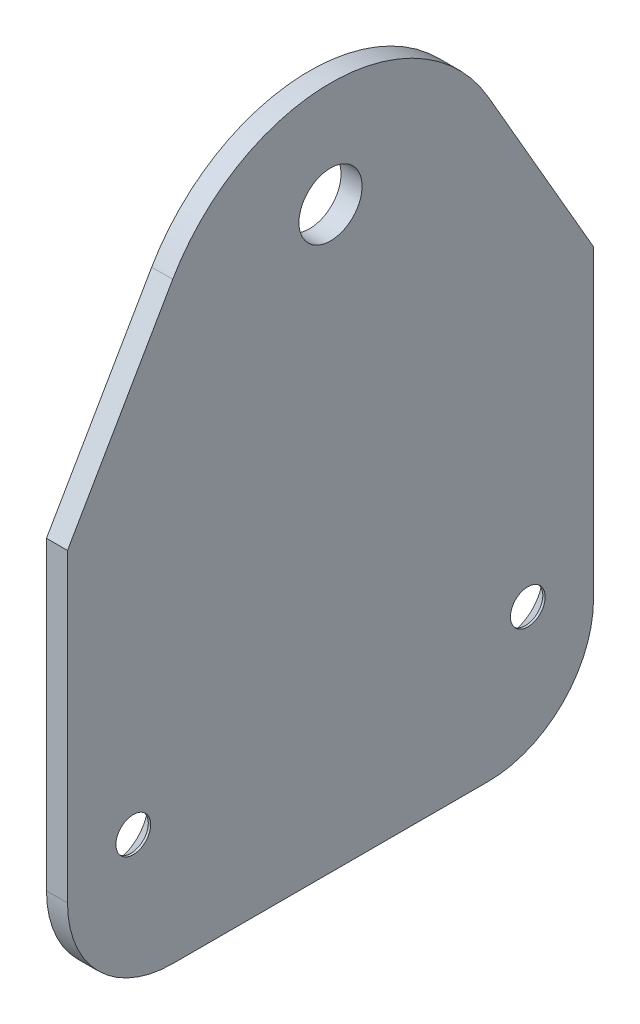
ISO-10303-21;
HEADER;
FILE_DESCRIPTION(('STEP AP214'),'2;1');
FILE_NAME('part.step','',(''),(''),'','','');
FILE_SCHEMA(('AUTOMOTIVE_DESIGN { 1 0 10303 214 1 1 1 1 }'));
ENDSEC;
DATA;
#1=APPLICATION_CONTEXT('core data for automotive mechanical design processes');
#2=APPLICATION_PROTOCOL_DEFINITION('international standard','automotive_design',2000,#1);
#3=PRODUCT_CONTEXT('',#1,'mechanical');
#4=PRODUCT('Part','Part','',(#3));
#5=PRODUCT_RELATED_PRODUCT_CATEGORY('part','',(#4));
#6=PRODUCT_DEFINITION_FORMATION('','',#4);
#7=PRODUCT_DEFINITION_CONTEXT('part definition',#1,'design');
#8=PRODUCT_DEFINITION('design','',#6,#7);
#9=PRODUCT_DEFINITION_SHAPE('','',#8);
#10=(LENGTH_UNIT() NAMED_UNIT(*) SI_UNIT(.MILLI.,.METRE.));
#11=(NAMED_UNIT(*) PLANE_ANGLE_UNIT() SI_UNIT($,.RADIAN.));
#12=(NAMED_UNIT(*) SI_UNIT($,.STERADIAN.) SOLID_ANGLE_UNIT());
#13=UNCERTAINTY_MEASURE_WITH_UNIT(LENGTH_MEASURE(1.E-05),#10,'distance_accuracy_value','');
#14=(GEOMETRIC_REPRESENTATION_CONTEXT(3) GLOBAL_UNCERTAINTY_ASSIGNED_CONTEXT((#13)) GLOBAL_UNIT_ASSIGNED_CONTEXT((#10,
#11,#12)) REPRESENTATION_CONTEXT('',''));
#15=CARTESIAN_POINT('',(0.,0.,0.));
#16=DIRECTION('',(0.,0.,1.));
#17=DIRECTION('',(1.,0.,0.));
#18=AXIS2_PLACEMENT_3D('',#15,#16,#17);
#19=CARTESIAN_POINT('',(-4.,95.3589838486225,0.));
#20=DIRECTION('',(-1.,0.,0.));
#21=DIRECTION('',(0.,0.,1.));
#22=AXIS2_PLACEMENT_3D('',#19,#20,#21);
#23=CYLINDRICAL_SURFACE('',#22,34.6410161513775);
#24=DIRECTION('',(1.,0.,0.));
#25=VECTOR('',#24,1.);
#26=CARTESIAN_POINT('',(-4.,112.679491924311,-29.9999999999999));
#27=LINE('',#26,#25);
#28=CARTESIAN_POINT('',(-4.,112.679491924311,-29.9999999999999));
#29=VERTEX_POINT('',#28);
#30=CARTESIAN_POINT('',(0.,112.679491924311,-29.9999999999999));
#31=VERTEX_POINT('',#30);
#32=EDGE_CURVE('E150',#29,#31,#27,.T.);
#33=ORIENTED_EDGE('',*,*,#32,.F.);
#34=CARTESIAN_POINT('',(-4.,95.3589838486225,0.));
#35=DIRECTION('',(-1.,0.,0.));
#36=DIRECTION('',(0.,0.,1.));
#37=AXIS2_PLACEMENT_3D('',#34,#35,#36);
#38=CIRCLE('',#37,34.6410161513775);
#39=CARTESIAN_POINT('',(-4.,112.679491924311,29.9999999999999));
#40=VERTEX_POINT('',#39);
#41=EDGE_CURVE('E155',#40,#29,#38,.T.);
#42=ORIENTED_EDGE('',*,*,#41,.F.);
#43=DIRECTION('',(1.,0.,0.));
#44=VECTOR('',#43,1.);
#45=CARTESIAN_POINT('',(-4.,112.679491924311,29.9999999999999));
#46=LINE('',#45,#44);
#47=CARTESIAN_POINT('',(0.,112.679491924311,29.9999999999999));
#48=VERTEX_POINT('',#47);
#49=EDGE_CURVE('E153',#48,#40,#46,.F.);
#50=ORIENTED_EDGE('',*,*,#49,.F.);
#51=CARTESIAN_POINT('',(0.,95.3589838486225,0.));
#52=DIRECTION('',(-1.,0.,0.));
#53=DIRECTION('',(0.,0.,1.));
#54=AXIS2_PLACEMENT_3D('',#51,#52,#53);
#55=CIRCLE('',#54,34.6410161513775);
#56=EDGE_CURVE('E118',#31,#48,#55,.F.);
#57=ORIENTED_EDGE('',*,*,#56,.F.);
#58=EDGE_LOOP('',(#33,#42,#50,#57));
#59=FACE_BOUND('',#58,.T.);
#60=ADVANCED_FACE('F48',(#59),#23,.T.);
#61=CARTESIAN_POINT('',(-4.,0.,50.));
#62=DIRECTION('',(0.,0.,1.));
#63=DIRECTION('',(1.,0.,0.));
#64=AXIS2_PLACEMENT_3D('',#61,#62,#63);
#65=PLANE('',#64);
#66=DIRECTION('',(0.,-1.,0.));
#67=VECTOR('',#66,1.);
#68=CARTESIAN_POINT('',(-4.,0.,50.));
#69=LINE('',#68,#67);
#70=CARTESIAN_POINT('',(-4.,78.0384757729337,50.));
#71=VERTEX_POINT('',#70);
#72=CARTESIAN_POINT('',(-4.,20.,50.));
#73=VERTEX_POINT('',#72);
#74=EDGE_CURVE('E170',#71,#73,#69,.T.);
#75=ORIENTED_EDGE('',*,*,#74,.T.);
#76=DIRECTION('',(1.,0.,0.));
#77=VECTOR('',#76,1.);
#78=CARTESIAN_POINT('',(-4.,20.,50.));
#79=LINE('',#78,#77);
#80=CARTESIAN_POINT('',(0.,20.,50.));
#81=VERTEX_POINT('',#80);
#82=EDGE_CURVE('E132',#73,#81,#79,.T.);
#83=ORIENTED_EDGE('',*,*,#82,.T.);
#84=DIRECTION('',(0.,-1.,0.));
#85=VECTOR('',#84,1.);
#86=CARTESIAN_POINT('',(0.,0.,50.));
#87=LINE('',#86,#85);
#88=CARTESIAN_POINT('',(0.,78.0384757729337,50.));
#89=VERTEX_POINT('',#88);
#90=EDGE_CURVE('E116',#89,#81,#87,.T.);
#91=ORIENTED_EDGE('',*,*,#90,.F.);
#92=DIRECTION('',(-1.,0.,0.));
#93=VECTOR('',#92,1.);
#94=CARTESIAN_POINT('',(-4.,78.0384757729337,50.));
#95=LINE('',#94,#93);
#96=EDGE_CURVE('E123',#89,#71,#95,.T.);
#97=ORIENTED_EDGE('',*,*,#96,.T.);
#98=EDGE_LOOP('',(#75,#83,#91,#97));
#99=FACE_BOUND('',#98,.T.);
#100=ADVANCED_FACE('F129',(#99),#65,.T.);
#101=CARTESIAN_POINT('',(-4.,0.,-50.));
#102=DIRECTION('',(0.,0.,-1.));
#103=DIRECTION('',(-1.,0.,0.));
#104=AXIS2_PLACEMENT_3D('',#101,#102,#103);
#105=PLANE('',#104);
#106=DIRECTION('',(0.,1.,0.));
#107=VECTOR('',#106,1.);
#108=CARTESIAN_POINT('',(0.,0.,-50.));
#109=LINE('',#108,#107);
#110=CARTESIAN_POINT('',(0.,20.,-50.));
#111=VERTEX_POINT('',#110);
#112=CARTESIAN_POINT('',(0.,78.0384757729337,-50.));
#113=VERTEX_POINT('',#112);
#114=EDGE_CURVE('E174',#111,#113,#109,.T.);
#115=ORIENTED_EDGE('',*,*,#114,.F.);
#116=DIRECTION('',(1.,0.,0.));
#117=VECTOR('',#116,1.);
#118=CARTESIAN_POINT('',(-4.,20.,-50.));
#119=LINE('',#118,#117);
#120=CARTESIAN_POINT('',(-4.,20.,-50.));
#121=VERTEX_POINT('',#120);
#122=EDGE_CURVE('E12',#111,#121,#119,.F.);
#123=ORIENTED_EDGE('',*,*,#122,.T.);
#124=DIRECTION('',(0.,1.,0.));
#125=VECTOR('',#124,1.);
#126=CARTESIAN_POINT('',(-4.,0.,-50.));
#127=LINE('',#126,#125);
#128=CARTESIAN_POINT('',(-4.,78.0384757729337,-50.));
#129=VERTEX_POINT('',#128);
#130=EDGE_CURVE('E188',#121,#129,#127,.T.);
#131=ORIENTED_EDGE('',*,*,#130,.T.);
#132=DIRECTION('',(1.,0.,0.));
#133=VECTOR('',#132,1.);
#134=CARTESIAN_POINT('',(-4.,78.0384757729337,-50.));
#135=LINE('',#134,#133);
#136=EDGE_CURVE('E147',#129,#113,#135,.T.);
#137=ORIENTED_EDGE('',*,*,#136,.T.);
#138=EDGE_LOOP('',(#115,#123,#131,#137));
#139=FACE_BOUND('',#138,.T.);
#140=ADVANCED_FACE('F245',(#139),#105,.T.);
#141=CARTESIAN_POINT('',(-4.,0.,50.));
#142=DIRECTION('',(0.,-1.,0.));
#143=DIRECTION('',(0.,0.,-1.));
#144=AXIS2_PLACEMENT_3D('',#141,#142,#143);
#145=PLANE('',#144);
#146=DIRECTION('',(0.,0.,-1.));
#147=VECTOR('',#146,1.);
#148=CARTESIAN_POINT('',(0.,0.,50.));
#149=LINE('',#148,#147);
#150=CARTESIAN_POINT('',(0.,0.,30.));
#151=VERTEX_POINT('',#150);
#152=CARTESIAN_POINT('',(0.,0.,-30.));
#153=VERTEX_POINT('',#152);
#154=EDGE_CURVE('E133',#151,#153,#149,.T.);
#155=ORIENTED_EDGE('',*,*,#154,.F.);
#156=DIRECTION('',(1.,0.,0.));
#157=VECTOR('',#156,1.);
#158=CARTESIAN_POINT('',(-4.,0.,30.));
#159=LINE('',#158,#157);
#160=CARTESIAN_POINT('',(-4.,0.,30.));
#161=VERTEX_POINT('',#160);
#162=EDGE_CURVE('E166',#151,#161,#159,.F.);
#163=ORIENTED_EDGE('',*,*,#162,.T.);
#164=DIRECTION('',(0.,0.,-1.));
#165=VECTOR('',#164,1.);
#166=CARTESIAN_POINT('',(-4.,0.,50.));
#167=LINE('',#166,#165);
#168=CARTESIAN_POINT('',(-4.,0.,-30.));
#169=VERTEX_POINT('',#168);
#170=EDGE_CURVE('E171',#161,#169,#167,.T.);
#171=ORIENTED_EDGE('',*,*,#170,.T.);
#172=DIRECTION('',(1.,0.,0.));
#173=VECTOR('',#172,1.);
#174=CARTESIAN_POINT('',(-4.,0.,-30.));
#175=LINE('',#174,#173);
#176=EDGE_CURVE('E163',#169,#153,#175,.T.);
#177=ORIENTED_EDGE('',*,*,#176,.T.);
#178=EDGE_LOOP('',(#155,#163,#171,#177));
#179=FACE_BOUND('',#178,.T.);
#180=ADVANCED_FACE('F180',(#179),#145,.T.);
#181=CARTESIAN_POINT('',(-4.,0.,0.));
#182=DIRECTION('',(-1.,0.,0.));
#183=DIRECTION('',(0.,0.,1.));
#184=AXIS2_PLACEMENT_3D('',#181,#182,#183);
#185=PLANE('',#184);
#186=CARTESIAN_POINT('',(-4.,25.,-37.5));
#187=DIRECTION('',(-1.,0.,0.));
#188=DIRECTION('',(0.,0.,1.));
#189=AXIS2_PLACEMENT_3D('',#186,#187,#188);
#190=CIRCLE('',#189,6.855);
#191=CARTESIAN_POINT('',(-4.,25.,-30.645));
#192=VERTEX_POINT('',#191);
#193=EDGE_CURVE('E209',#192,#192,#190,.T.);
#194=ORIENTED_EDGE('',*,*,#193,.F.);
#195=EDGE_LOOP('',(#194));
#196=FACE_BOUND('',#195,.T.);
#197=CARTESIAN_POINT('',(-4.,25.,37.5));
#198=DIRECTION('',(-1.,0.,0.));
#199=DIRECTION('',(0.,0.,1.));
#200=AXIS2_PLACEMENT_3D('',#197,#198,#199);
#201=CIRCLE('',#200,6.855);
#202=CARTESIAN_POINT('',(-4.,25.,44.355));
#203=VERTEX_POINT('',#202);
#204=EDGE_CURVE('E200',#203,#203,#201,.T.);
#205=ORIENTED_EDGE('',*,*,#204,.F.);
#206=EDGE_LOOP('',(#205));
#207=FACE_BOUND('',#206,.T.);
#208=CARTESIAN_POINT('',(-4.,110.,0.));
#209=DIRECTION('',(-1.,0.,0.));
#210=DIRECTION('',(0.,0.,1.));
#211=AXIS2_PLACEMENT_3D('',#208,#209,#210);
#212=CIRCLE('',#211,6.);
#213=CARTESIAN_POINT('',(-4.,110.,6.));
#214=VERTEX_POINT('',#213);
#215=EDGE_CURVE('E187',#214,#214,#212,.T.);
#216=ORIENTED_EDGE('',*,*,#215,.F.);
#217=EDGE_LOOP('',(#216));
#218=FACE_BOUND('',#217,.T.);
#219=ORIENTED_EDGE('',*,*,#170,.F.);
#220=CARTESIAN_POINT('',(-4.,20.,30.));
#221=DIRECTION('',(-1.,0.,0.));
#222=DIRECTION('',(0.,0.,1.));
#223=AXIS2_PLACEMENT_3D('',#220,#221,#222);
#224=CIRCLE('',#223,20.);
#225=EDGE_CURVE('E56',#161,#73,#224,.T.);
#226=ORIENTED_EDGE('',*,*,#225,.T.);
#227=ORIENTED_EDGE('',*,*,#74,.F.);
#228=DIRECTION('',(0.,-0.866025403784438,0.500000000000001));
#229=VECTOR('',#228,1.);
#230=CARTESIAN_POINT('',(-4.,41.1602540378445,71.2916512459885));
#231=LINE('',#230,#229);
#232=EDGE_CURVE('E139',#71,#40,#231,.F.);
#233=ORIENTED_EDGE('',*,*,#232,.T.);
#234=ORIENTED_EDGE('',*,*,#41,.T.);
#235=DIRECTION('',(0.,0.866025403784438,0.500000000000001));
#236=VECTOR('',#235,1.);
#237=CARTESIAN_POINT('',(-4.,41.1602540378445,-71.2916512459885));
#238=LINE('',#237,#236);
#239=EDGE_CURVE('E140',#29,#129,#238,.F.);
#240=ORIENTED_EDGE('',*,*,#239,.T.);
#241=ORIENTED_EDGE('',*,*,#130,.F.);
#242=CARTESIAN_POINT('',(-4.,20.,-30.));
#243=DIRECTION('',(-1.,0.,0.));
#244=DIRECTION('',(0.,0.,1.));
#245=AXIS2_PLACEMENT_3D('',#242,#243,#244);
#246=CIRCLE('',#245,20.);
#247=EDGE_CURVE('E68',#121,#169,#246,.T.);
#248=ORIENTED_EDGE('',*,*,#247,.T.);
#249=EDGE_LOOP('',(#219,#226,#227,#233,#234,#240,#241,#248));
#250=FACE_BOUND('',#249,.T.);
#251=ADVANCED_FACE('F169',(#196,#207,#218,#250),#185,.T.);
#252=CARTESIAN_POINT('',(0.,0.,0.));
#253=DIRECTION('',(-1.,0.,0.));
#254=DIRECTION('',(0.,0.,1.));
#255=AXIS2_PLACEMENT_3D('',#252,#253,#254);
#256=PLANE('',#255);
#257=CARTESIAN_POINT('',(0.,25.,-37.5));
#258=DIRECTION('',(-1.,0.,0.));
#259=DIRECTION('',(0.,0.,1.));
#260=AXIS2_PLACEMENT_3D('',#257,#258,#259);
#261=CIRCLE('',#260,3.3);
#262=CARTESIAN_POINT('',(0.,25.,-34.2));
#263=VERTEX_POINT('',#262);
#264=EDGE_CURVE('E203',#263,#263,#261,.T.);
#265=ORIENTED_EDGE('',*,*,#264,.T.);
#266=EDGE_LOOP('',(#265));
#267=FACE_BOUND('',#266,.T.);
#268=CARTESIAN_POINT('',(0.,25.,37.5));
#269=DIRECTION('',(-1.,0.,0.));
#270=DIRECTION('',(0.,0.,1.));
#271=AXIS2_PLACEMENT_3D('',#268,#269,#270);
#272=CIRCLE('',#271,3.3);
#273=CARTESIAN_POINT('',(0.,25.,40.8));
#274=VERTEX_POINT('',#273);
#275=EDGE_CURVE('E194',#274,#274,#272,.T.);
#276=ORIENTED_EDGE('',*,*,#275,.T.);
#277=EDGE_LOOP('',(#276));
#278=FACE_BOUND('',#277,.T.);
#279=CARTESIAN_POINT('',(0.,110.,0.));
#280=DIRECTION('',(-1.,0.,0.));
#281=DIRECTION('',(0.,0.,1.));
#282=AXIS2_PLACEMENT_3D('',#279,#280,#281);
#283=CIRCLE('',#282,6.);
#284=CARTESIAN_POINT('',(0.,110.,6.));
#285=VERTEX_POINT('',#284);
#286=EDGE_CURVE('E134',#285,#285,#283,.T.);
#287=ORIENTED_EDGE('',*,*,#286,.T.);
#288=EDGE_LOOP('',(#287));
#289=FACE_BOUND('',#288,.T.);
#290=ORIENTED_EDGE('',*,*,#90,.T.);
#291=CARTESIAN_POINT('',(0.,20.,30.));
#292=DIRECTION('',(-1.,0.,0.));
#293=DIRECTION('',(0.,0.,1.));
#294=AXIS2_PLACEMENT_3D('',#291,#292,#293);
#295=CIRCLE('',#294,20.);
#296=EDGE_CURVE('E161',#81,#151,#295,.F.);
#297=ORIENTED_EDGE('',*,*,#296,.T.);
#298=ORIENTED_EDGE('',*,*,#154,.T.);
#299=CARTESIAN_POINT('',(0.,20.,-30.));
#300=DIRECTION('',(-1.,0.,0.));
#301=DIRECTION('',(0.,0.,1.));
#302=AXIS2_PLACEMENT_3D('',#299,#300,#301);
#303=CIRCLE('',#302,20.);
#304=EDGE_CURVE('E159',#153,#111,#303,.F.);
#305=ORIENTED_EDGE('',*,*,#304,.T.);
#306=ORIENTED_EDGE('',*,*,#114,.T.);
#307=DIRECTION('',(0.,-0.866025403784438,-0.500000000000001));
#308=VECTOR('',#307,1.);
#309=CARTESIAN_POINT('',(0.,78.0384757729337,-50.));
#310=LINE('',#309,#308);
#311=EDGE_CURVE('E124',#113,#31,#310,.F.);
#312=ORIENTED_EDGE('',*,*,#311,.T.);
#313=ORIENTED_EDGE('',*,*,#56,.T.);
#314=DIRECTION('',(0.,0.866025403784438,-0.500000000000001));
#315=VECTOR('',#314,1.);
#316=CARTESIAN_POINT('',(0.,130.,19.9999999999999));
#317=LINE('',#316,#315);
#318=EDGE_CURVE('E113',#48,#89,#317,.F.);
#319=ORIENTED_EDGE('',*,*,#318,.T.);
#320=EDGE_LOOP('',(#290,#297,#298,#305,#306,#312,#313,#319));
#321=FACE_BOUND('',#320,.T.);
#322=ADVANCED_FACE('F115',(#267,#278,#289,#321),#256,.F.);
#323=CARTESIAN_POINT('',(6.,110.,0.));
#324=DIRECTION('',(-1.,0.,0.));
#325=DIRECTION('',(0.,0.,1.));
#326=AXIS2_PLACEMENT_3D('',#323,#324,#325);
#327=CYLINDRICAL_SURFACE('',#326,6.);
#328=ORIENTED_EDGE('',*,*,#215,.T.);
#329=EDGE_LOOP('',(#328));
#330=FACE_BOUND('',#329,.T.);
#331=ORIENTED_EDGE('',*,*,#286,.F.);
#332=EDGE_LOOP('',(#331));
#333=FACE_BOUND('',#332,.T.);
#334=ADVANCED_FACE('F222',(#330,#333),#327,.F.);
#335=CARTESIAN_POINT('',(-4.,25.,37.5));
#336=DIRECTION('',(-1.,0.,0.));
#337=DIRECTION('',(0.,0.,1.));
#338=AXIS2_PLACEMENT_3D('',#335,#336,#337);
#339=CYLINDRICAL_SURFACE('',#338,3.3);
#340=ORIENTED_EDGE('',*,*,#275,.F.);
#341=EDGE_LOOP('',(#340));
#342=FACE_BOUND('',#341,.T.);
#343=CARTESIAN_POINT('',(-0.444999999999998,25.,37.5));
#344=DIRECTION('',(-1.,0.,0.));
#345=DIRECTION('',(0.,0.,1.));
#346=AXIS2_PLACEMENT_3D('',#343,#344,#345);
#347=CIRCLE('',#346,3.3);
#348=CARTESIAN_POINT('',(-0.444999999999998,25.,40.8));
#349=VERTEX_POINT('',#348);
#350=EDGE_CURVE('E197',#349,#349,#347,.T.);
#351=ORIENTED_EDGE('',*,*,#350,.T.);
#352=EDGE_LOOP('',(#351));
#353=FACE_BOUND('',#352,.T.);
#354=ADVANCED_FACE('F225',(#342,#353),#339,.F.);
#355=CARTESIAN_POINT('',(-4.,25.,37.5));
#356=DIRECTION('',(-1.,0.,0.));
#357=DIRECTION('',(0.,0.,1.));
#358=AXIS2_PLACEMENT_3D('',#355,#356,#357);
#359=CONICAL_SURFACE('',#358,6.855,0.785398163397448);
#360=ORIENTED_EDGE('',*,*,#350,.F.);
#361=EDGE_LOOP('',(#360));
#362=FACE_BOUND('',#361,.T.);
#363=ORIENTED_EDGE('',*,*,#204,.T.);
#364=EDGE_LOOP('',(#363));
#365=FACE_BOUND('',#364,.T.);
#366=ADVANCED_FACE('F305',(#362,#365),#359,.F.);
#367=CARTESIAN_POINT('',(-4.,25.,-37.5));
#368=DIRECTION('',(-1.,0.,0.));
#369=DIRECTION('',(0.,0.,1.));
#370=AXIS2_PLACEMENT_3D('',#367,#368,#369);
#371=CYLINDRICAL_SURFACE('',#370,3.3);
#372=ORIENTED_EDGE('',*,*,#264,.F.);
#373=EDGE_LOOP('',(#372));
#374=FACE_BOUND('',#373,.T.);
#375=CARTESIAN_POINT('',(-0.444999999999998,25.,-37.5));
#376=DIRECTION('',(-1.,0.,0.));
#377=DIRECTION('',(0.,0.,1.));
#378=AXIS2_PLACEMENT_3D('',#375,#376,#377);
#379=CIRCLE('',#378,3.3);
#380=CARTESIAN_POINT('',(-0.444999999999998,25.,-34.2));
#381=VERTEX_POINT('',#380);
#382=EDGE_CURVE('E206',#381,#381,#379,.T.);
#383=ORIENTED_EDGE('',*,*,#382,.T.);
#384=EDGE_LOOP('',(#383));
#385=FACE_BOUND('',#384,.T.);
#386=ADVANCED_FACE('F315',(#374,#385),#371,.F.);
#387=CARTESIAN_POINT('',(-4.,25.,-37.5));
#388=DIRECTION('',(-1.,0.,0.));
#389=DIRECTION('',(0.,0.,1.));
#390=AXIS2_PLACEMENT_3D('',#387,#388,#389);
#391=CONICAL_SURFACE('',#390,6.855,0.785398163397448);
#392=ORIENTED_EDGE('',*,*,#382,.F.);
#393=EDGE_LOOP('',(#392));
#394=FACE_BOUND('',#393,.T.);
#395=ORIENTED_EDGE('',*,*,#193,.T.);
#396=EDGE_LOOP('',(#395));
#397=FACE_BOUND('',#396,.T.);
#398=ADVANCED_FACE('F213',(#394,#397),#391,.F.);
#399=CARTESIAN_POINT('',(-4.,130.,19.9999999999999));
#400=DIRECTION('',(0.,-0.500000000000001,-0.866025403784438));
#401=DIRECTION('',(1.,0.,0.));
#402=AXIS2_PLACEMENT_3D('',#399,#400,#401);
#403=PLANE('',#402);
#404=ORIENTED_EDGE('',*,*,#318,.F.);
#405=ORIENTED_EDGE('',*,*,#49,.T.);
#406=ORIENTED_EDGE('',*,*,#232,.F.);
#407=ORIENTED_EDGE('',*,*,#96,.F.);
#408=EDGE_LOOP('',(#404,#405,#406,#407));
#409=FACE_BOUND('',#408,.T.);
#410=ADVANCED_FACE('F137',(#409),#403,.F.);
#411=CARTESIAN_POINT('',(-4.,78.0384757729337,-50.));
#412=DIRECTION('',(0.,-0.500000000000001,0.866025403784438));
#413=DIRECTION('',(1.,0.,0.));
#414=AXIS2_PLACEMENT_3D('',#411,#412,#413);
#415=PLANE('',#414);
#416=ORIENTED_EDGE('',*,*,#239,.F.);
#417=ORIENTED_EDGE('',*,*,#32,.T.);
#418=ORIENTED_EDGE('',*,*,#311,.F.);
#419=ORIENTED_EDGE('',*,*,#136,.F.);
#420=EDGE_LOOP('',(#416,#417,#418,#419));
#421=FACE_BOUND('',#420,.T.);
#422=ADVANCED_FACE('F253',(#421),#415,.F.);
#423=CARTESIAN_POINT('',(-4.,20.,30.));
#424=DIRECTION('',(1.,0.,0.));
#425=DIRECTION('',(0.,0.,-1.));
#426=AXIS2_PLACEMENT_3D('',#423,#424,#425);
#427=CYLINDRICAL_SURFACE('',#426,20.);
#428=ORIENTED_EDGE('',*,*,#225,.F.);
#429=ORIENTED_EDGE('',*,*,#162,.F.);
#430=ORIENTED_EDGE('',*,*,#296,.F.);
#431=ORIENTED_EDGE('',*,*,#82,.F.);
#432=EDGE_LOOP('',(#428,#429,#430,#431));
#433=FACE_BOUND('',#432,.T.);
#434=ADVANCED_FACE('F176',(#433),#427,.T.);
#435=CARTESIAN_POINT('',(-4.,20.,-30.));
#436=DIRECTION('',(1.,0.,0.));
#437=DIRECTION('',(0.,0.,-1.));
#438=AXIS2_PLACEMENT_3D('',#435,#436,#437);
#439=CYLINDRICAL_SURFACE('',#438,20.);
#440=ORIENTED_EDGE('',*,*,#247,.F.);
#441=ORIENTED_EDGE('',*,*,#122,.F.);
#442=ORIENTED_EDGE('',*,*,#304,.F.);
#443=ORIENTED_EDGE('',*,*,#176,.F.);
#444=EDGE_LOOP('',(#440,#441,#442,#443));
#445=FACE_BOUND('',#444,.T.);
#446=ADVANCED_FACE('F50',(#445),#439,.T.);
#447=CLOSED_SHELL('',(#60,#100,#140,#180,#251,#322,#334,#354,#366,#386,#398,#410,#422,#434,#446));
#448=MANIFOLD_SOLID_BREP('B2',#447);
#449=ADVANCED_BREP_SHAPE_REPRESENTATION('',(#18,#448),#14);
#450=SHAPE_DEFINITION_REPRESENTATION(#9,#449);
ENDSEC;
END-ISO-10303-21;
